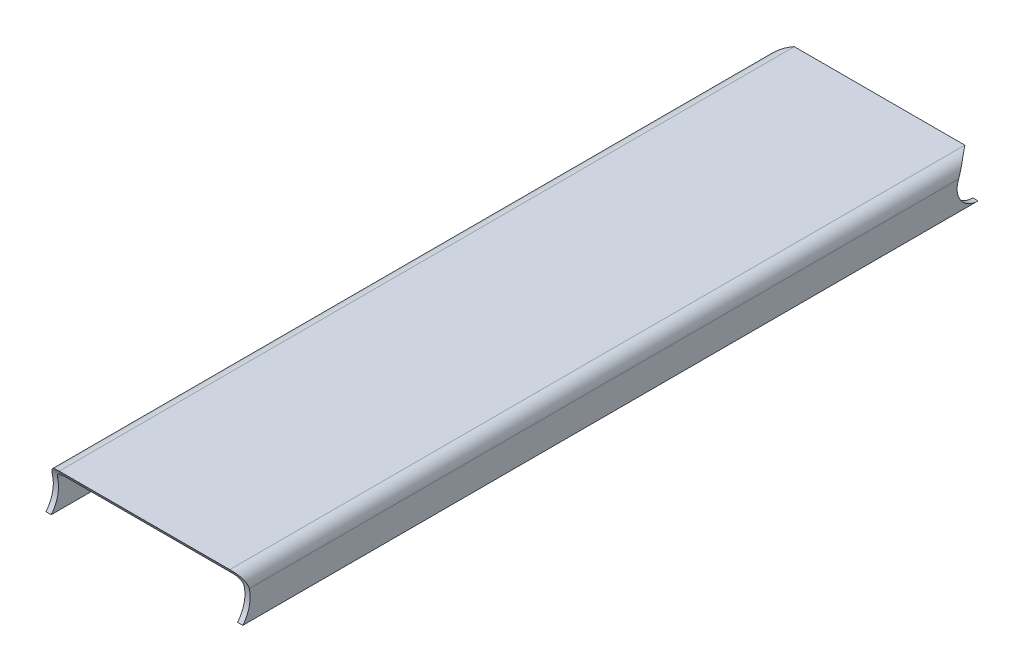
ISO-10303-21;
HEADER;
FILE_DESCRIPTION(('STEP AP214'),'2;1');
FILE_NAME('part.step','',(''),(''),'','','');
FILE_SCHEMA(('AUTOMOTIVE_DESIGN { 1 0 10303 214 1 1 1 1 }'));
ENDSEC;
DATA;
#1=APPLICATION_CONTEXT('core data for automotive mechanical design processes');
#2=APPLICATION_PROTOCOL_DEFINITION('international standard','automotive_design',2000,#1);
#3=PRODUCT_CONTEXT('',#1,'mechanical');
#4=PRODUCT('Part','Part','',(#3));
#5=PRODUCT_RELATED_PRODUCT_CATEGORY('part','',(#4));
#6=PRODUCT_DEFINITION_FORMATION('','',#4);
#7=PRODUCT_DEFINITION_CONTEXT('part definition',#1,'design');
#8=PRODUCT_DEFINITION('design','',#6,#7);
#9=PRODUCT_DEFINITION_SHAPE('','',#8);
#10=(LENGTH_UNIT() NAMED_UNIT(*) SI_UNIT(.MILLI.,.METRE.));
#11=(NAMED_UNIT(*) PLANE_ANGLE_UNIT() SI_UNIT($,.RADIAN.));
#12=(NAMED_UNIT(*) SI_UNIT($,.STERADIAN.) SOLID_ANGLE_UNIT());
#13=UNCERTAINTY_MEASURE_WITH_UNIT(LENGTH_MEASURE(1.E-05),#10,'distance_accuracy_value','');
#14=(GEOMETRIC_REPRESENTATION_CONTEXT(3) GLOBAL_UNCERTAINTY_ASSIGNED_CONTEXT((#13)) GLOBAL_UNIT_ASSIGNED_CONTEXT((#10,
#11,#12)) REPRESENTATION_CONTEXT('',''));
#15=CARTESIAN_POINT('',(0.,0.,0.));
#16=DIRECTION('',(0.,0.,1.));
#17=DIRECTION('',(1.,0.,0.));
#18=AXIS2_PLACEMENT_3D('',#15,#16,#17);
#19=CARTESIAN_POINT('',(0.,205.95,0.));
#20=DIRECTION('',(0.,-1.,0.));
#21=DIRECTION('',(0.,0.,-1.));
#22=AXIS2_PLACEMENT_3D('',#19,#20,#21);
#23=PLANE('',#22);
#24=DIRECTION('',(0.,0.,-1.));
#25=VECTOR('',#24,1.);
#26=CARTESIAN_POINT('',(-45.529019681865,205.95,-290.));
#27=LINE('',#26,#25);
#28=CARTESIAN_POINT('',(-45.529019681865,205.95,-11.2199598930941));
#29=VERTEX_POINT('',#28);
#30=CARTESIAN_POINT('',(-45.529019681865,205.95,-284.727429469414));
#31=VERTEX_POINT('',#30);
#32=EDGE_CURVE('E172',#29,#31,#27,.T.);
#33=ORIENTED_EDGE('',*,*,#32,.F.);
#34=DIRECTION('',(-1.,0.,0.));
#35=VECTOR('',#34,1.);
#36=CARTESIAN_POINT('',(170.,205.95,-11.2199598930941));
#37=LINE('',#36,#35);
#38=CARTESIAN_POINT('',(-110.529019681865,205.95,-11.2199598930941));
#39=VERTEX_POINT('',#38);
#40=EDGE_CURVE('E148',#29,#39,#37,.T.);
#41=ORIENTED_EDGE('',*,*,#40,.T.);
#42=DIRECTION('',(0.,0.,1.));
#43=VECTOR('',#42,1.);
#44=CARTESIAN_POINT('',(-110.529019681865,205.95,-9.90391336807483));
#45=LINE('',#44,#43);
#46=CARTESIAN_POINT('',(-110.529019681865,205.95,-284.727429469414));
#47=VERTEX_POINT('',#46);
#48=EDGE_CURVE('E278',#47,#39,#45,.T.);
#49=ORIENTED_EDGE('',*,*,#48,.F.);
#50=DIRECTION('',(1.,0.,0.));
#51=VECTOR('',#50,1.);
#52=CARTESIAN_POINT('',(-170.,205.95,-284.727429469414));
#53=LINE('',#52,#51);
#54=EDGE_CURVE('E188',#47,#31,#53,.T.);
#55=ORIENTED_EDGE('',*,*,#54,.T.);
#56=EDGE_LOOP('',(#33,#41,#49,#55));
#57=FACE_BOUND('',#56,.T.);
#58=ADVANCED_FACE('F77',(#57),#23,.T.);
#59=CARTESIAN_POINT('',(-45.529019681865,202.95,-9.90391336807489));
#60=DIRECTION('',(0.,0.,1.));
#61=DIRECTION('',(1.,0.,0.));
#62=AXIS2_PLACEMENT_3D('',#59,#60,#61);
#63=CYLINDRICAL_SURFACE('',#62,5.);
#64=DIRECTION('',(0.,0.,-1.));
#65=VECTOR('',#64,1.);
#66=CARTESIAN_POINT('',(-45.529019681865,207.95,-290.));
#67=LINE('',#66,#65);
#68=CARTESIAN_POINT('',(-45.529019681865,207.95,-9.90391336807463));
#69=VERTEX_POINT('',#68);
#70=CARTESIAN_POINT('',(-45.529019681865,207.95,-290.));
#71=VERTEX_POINT('',#70);
#72=EDGE_CURVE('E199',#69,#71,#67,.T.);
#73=ORIENTED_EDGE('',*,*,#72,.F.);
#74=CARTESIAN_POINT('',(-45.529019681865,207.95,-9.90391336807484));
#75=CARTESIAN_POINT('',(-45.406029606907,207.950028263612,-9.90387003739503));
#76=CARTESIAN_POINT('',(-45.283067196336,207.945463134045,-9.90755479631774));
#77=CARTESIAN_POINT('',(-45.038333556143,207.927368144166,-9.92205001642596));
#78=CARTESIAN_POINT('',(-44.9165613594909,207.913846305578,-9.93285410142215));
#79=CARTESIAN_POINT('',(-44.6760920044716,207.878203256688,-9.9611442695003));
#80=CARTESIAN_POINT('',(-44.5573779843092,207.856152138718,-9.97857586925518));
#81=CARTESIAN_POINT('',(-44.3228685379817,207.803828309326,-10.0195493534041));
#82=CARTESIAN_POINT('',(-44.2070736278657,207.773554155196,-10.0430923099859));
#83=CARTESIAN_POINT('',(-43.8659539278287,207.671263765976,-10.1217149752835));
#84=CARTESIAN_POINT('',(-43.6458631228655,207.587621648726,-10.1849191863722));
#85=CARTESIAN_POINT('',(-43.2234939339058,207.392848682418,-10.327162824902));
#86=CARTESIAN_POINT('',(-43.0212544181685,207.281659764191,-10.4062356358823));
#87=CARTESIAN_POINT('',(-42.6145450001111,207.020721613183,-10.5842903675734));
#88=CARTESIAN_POINT('',(-42.4125376145767,206.867995568645,-10.6845177380025));
#89=CARTESIAN_POINT('',(-42.0352981795909,206.535684114599,-10.8909630428112));
#90=CARTESIAN_POINT('',(-41.8600817506678,206.356083155436,-10.9971844229771));
#91=CARTESIAN_POINT('',(-41.6042300096735,206.051275828594,-11.1664196358224));
#92=CARTESIAN_POINT('',(-41.5141837617727,205.933794372096,-11.229370295272));
#93=CARTESIAN_POINT('',(-41.3446600516661,205.69099316407,-11.3543476175291));
#94=CARTESIAN_POINT('',(-41.2651796354233,205.565675617855,-11.4163745342755));
#95=CARTESIAN_POINT('',(-41.1173749970728,205.30785076524,-11.5385034659709));
#96=CARTESIAN_POINT('',(-41.0490442832171,205.175347702813,-11.5986065845169));
#97=CARTESIAN_POINT('',(-40.9241312627906,204.903796877641,-11.7159992356617));
#98=CARTESIAN_POINT('',(-40.8675430407298,204.764752453743,-11.7732901737865));
#99=CARTESIAN_POINT('',(-40.7705292940144,204.491487818732,-11.8800847743001));
#100=CARTESIAN_POINT('',(-40.7292102995672,204.357687032058,-11.9298502651749));
#101=CARTESIAN_POINT('',(-40.6577195670634,204.085861885648,-12.0256602007596));
#102=CARTESIAN_POINT('',(-40.6275455160423,203.947838408714,-12.071705416005));
#103=CARTESIAN_POINT('',(-40.578775760473,203.667868703096,-12.1596999317561));
#104=CARTESIAN_POINT('',(-40.5602247440612,203.525909499091,-12.2016329069738));
#105=CARTESIAN_POINT('',(-40.5353335012985,203.239521061336,-12.2807883295957));
#106=CARTESIAN_POINT('',(-40.529002162767,203.095090106762,-12.3180073299831));
#107=CARTESIAN_POINT('',(-40.529019681865,202.95,-12.3526312987521));
#108=B_SPLINE_CURVE_WITH_KNOTS('',3,(#74,#75,#76,#77,#78,#79,#80,#81,#82,#83,#84,#85,#86,#87,
#88,#89,#90,#91,#92,#93,#94,#95,#96,#97,#98,#99,#100,#101,#102,#103,#104,#105,#106,#107),
.UNSPECIFIED.,.F.,.F.,(4,2,2,2,2,2,2,2,2,2,2,2,2,2,2,2,4),(0.,0.368785478718362,
0.737241115002246,1.10273105365868,1.46828515793402,2.19628036676051,2.9258234591652,
3.73999202725768,4.55463350274145,5.03671738434816,5.51866619829262,6.0003333956542,
6.48175735231109,6.92710108438181,7.37235234009174,7.81930515468036,8.26658293209325),.UNSPECIFIED.);
#109=CARTESIAN_POINT('',(-40.529019681865,202.95,-12.3526312987521));
#110=VERTEX_POINT('',#109);
#111=EDGE_CURVE('E96',#69,#110,#108,.T.);
#112=ORIENTED_EDGE('',*,*,#111,.T.);
#113=DIRECTION('',(0.,0.,1.));
#114=VECTOR('',#113,1.);
#115=CARTESIAN_POINT('',(-40.529019681865,202.95,-290.));
#116=LINE('',#115,#114);
#117=CARTESIAN_POINT('',(-40.529019681865,202.95,-282.617588469883));
#118=VERTEX_POINT('',#117);
#119=EDGE_CURVE('E181',#110,#118,#116,.F.);
#120=ORIENTED_EDGE('',*,*,#119,.T.);
#121=CARTESIAN_POINT('',(-40.529019681865,202.95,-282.617588469883));
#122=CARTESIAN_POINT('',(-40.5290006438511,203.094931821978,-282.675463827754));
#123=CARTESIAN_POINT('',(-40.5353185446872,203.238045744755,-282.73763778325));
#124=CARTESIAN_POINT('',(-40.5595467178436,203.519370186592,-282.869748468944));
#125=CARTESIAN_POINT('',(-40.5774385287805,203.657588145444,-282.939672689866));
#126=CARTESIAN_POINT('',(-40.6235047457603,203.926946853483,-283.085892428578));
#127=CARTESIAN_POINT('',(-40.6515729342616,204.058145199173,-283.162116069589));
#128=CARTESIAN_POINT('',(-40.7169519379051,204.314365453193,-283.320818221456));
#129=CARTESIAN_POINT('',(-40.754267337661,204.439384260822,-283.403299820787));
#130=CARTESIAN_POINT('',(-40.8473199770246,204.712771750927,-283.594801203025));
#131=CARTESIAN_POINT('',(-40.9053308329194,204.859299114923,-283.705350645005));
#132=CARTESIAN_POINT('',(-41.0322221157953,205.141521236854,-283.933678830624));
#133=CARTESIAN_POINT('',(-41.1011040687234,205.277214469999,-284.051458587743));
#134=CARTESIAN_POINT('',(-41.3222111949956,205.668999382745,-284.415009892091));
#135=CARTESIAN_POINT('',(-41.4884924222867,205.908675042715,-284.670193528565));
#136=CARTESIAN_POINT('',(-41.792830758326,206.278610664027,-285.117526100105));
#137=CARTESIAN_POINT('',(-41.9241844559385,206.42002452699,-285.305360025082));
#138=CARTESIAN_POINT('',(-42.1970863137683,206.682838893356,-285.687699864838));
#139=CARTESIAN_POINT('',(-42.3386383834921,206.804231662465,-285.882208323148));
#140=CARTESIAN_POINT('',(-42.6297228499866,207.027717675519,-286.276415677275));
#141=CARTESIAN_POINT('',(-42.7792603017452,207.129798504181,-286.476117818822));
#142=CARTESIAN_POINT('',(-43.0844293214526,207.315301306491,-286.879403912582));
#143=CARTESIAN_POINT('',(-43.2400601794145,207.398725446408,-287.08298741114));
#144=CARTESIAN_POINT('',(-43.5680398380916,207.553246308351,-287.508795038494));
#145=CARTESIAN_POINT('',(-43.7407573471275,207.622913805874,-287.731254770753));
#146=CARTESIAN_POINT('',(-44.0899628153071,207.741990355377,-288.178547174042));
#147=CARTESIAN_POINT('',(-44.2664515149026,207.79139538976,-288.40338030661));
#148=CARTESIAN_POINT('',(-44.7988538490088,207.909716146546,-289.07928503644));
#149=CARTESIAN_POINT('',(-45.1586961007198,207.94919199385,-289.533039615997));
#150=CARTESIAN_POINT('',(-45.5216326749521,207.949995903375,-289.990685336482));
#151=CARTESIAN_POINT('',(-45.5253262132618,207.949999995808,-289.995342711109));
#152=CARTESIAN_POINT('',(-45.529019681865,207.95,-290.));
#153=B_SPLINE_CURVE_WITH_KNOTS('',3,(#121,#122,#123,#124,#125,#126,#127,#128,#129,#130,#131,
#132,#133,#134,#135,#136,#137,#138,#139,#140,#141,#142,#143,#144,#145,#146,#147,#148,#149,#150,
#151,#152),.UNSPECIFIED.,.F.,.F.,(4,2,2,2,2,2,2,2,2,2,2,2,2,2,2,4),(0.,0.467846636004104,
0.934948850335887,1.39730971646662,1.85990027365544,2.43652711880958,3.01323497565311,
4.17090510043605,4.97797349507664,5.78535293954343,6.59324968228011,7.40105256962869,
8.27058662243376,9.14029300126098,10.8747034749208,10.8925360336479),.UNSPECIFIED.);
#154=EDGE_CURVE('E176',#118,#71,#153,.T.);
#155=ORIENTED_EDGE('',*,*,#154,.T.);
#156=EDGE_LOOP('',(#73,#112,#120,#155));
#157=FACE_BOUND('',#156,.T.);
#158=ADVANCED_FACE('F201',(#157),#63,.T.);
#159=CARTESIAN_POINT('',(-45.529019681865,202.95,-9.90391336807489));
#160=DIRECTION('',(0.,0.,1.));
#161=DIRECTION('',(1.,0.,0.));
#162=AXIS2_PLACEMENT_3D('',#159,#160,#161);
#163=CYLINDRICAL_SURFACE('',#162,3.);
#164=CARTESIAN_POINT('',(-45.529019681865,205.95,-11.219959893094));
#165=CARTESIAN_POINT('',(-45.4506356470062,205.950013000491,-11.2199463442241));
#166=CARTESIAN_POINT('',(-45.3722607519408,205.946928342112,-11.2215886554539));
#167=CARTESIAN_POINT('',(-45.216154561184,205.934664528441,-11.2280828540966));
#168=CARTESIAN_POINT('',(-45.1384230132917,205.925487888203,-11.2329334169905));
#169=CARTESIAN_POINT('',(-44.9845175626598,205.901196712448,-11.2457127048108));
#170=CARTESIAN_POINT('',(-44.9083381440571,205.886109653241,-11.2536271842443));
#171=CARTESIAN_POINT('',(-44.7577252915211,205.850190803088,-11.2723411993132));
#172=CARTESIAN_POINT('',(-44.6832919709854,205.829358640149,-11.2831409217652));
#173=CARTESIAN_POINT('',(-44.4635505539701,205.758625799063,-11.3194992440876));
#174=CARTESIAN_POINT('',(-44.3214678673102,205.700435128929,-11.3490461391817));
#175=CARTESIAN_POINT('',(-44.0493408390302,205.56415167147,-11.4164778864309));
#176=CARTESIAN_POINT('',(-43.9193091633716,205.486038261062,-11.4543713730075));
#177=CARTESIAN_POINT('',(-43.6661410862669,205.306937007493,-11.5384909215743));
#178=CARTESIAN_POINT('',(-43.5439080462504,205.20484512819,-11.5850840898714));
#179=CARTESIAN_POINT('',(-43.3177561936445,204.98356201734,-11.681981903289));
#180=CARTESIAN_POINT('',(-43.2138456681383,204.86436309244,-11.7322882133072));
#181=CARTESIAN_POINT('',(-43.0170283584053,204.59916121872,-11.838920401999));
#182=CARTESIAN_POINT('',(-42.9261661330417,204.451679881121,-11.8953569065385));
#183=CARTESIAN_POINT('',(-42.7709406586381,204.142833431299,-12.0064074845721));
#184=CARTESIAN_POINT('',(-42.7065636469668,203.981475582629,-12.0610224909864));
#185=CARTESIAN_POINT('',(-42.6146079442577,203.676127920498,-12.1571923278657));
#186=CARTESIAN_POINT('',(-42.582718106619,203.533647176579,-12.1994176989749));
#187=CARTESIAN_POINT('',(-42.5506207173596,203.316739106714,-12.2594820469814));
#188=CARTESIAN_POINT('',(-42.5425443824827,203.2438664437,-12.278967179084));
#189=CARTESIAN_POINT('',(-42.5317426939541,203.097391490401,-12.3167326043005));
#190=CARTESIAN_POINT('',(-42.5290190637343,203.023788972786,-12.3350125075316));
#191=CARTESIAN_POINT('',(-42.529019681865,202.95,-12.3526312987521));
#192=B_SPLINE_CURVE_WITH_KNOTS('',3,(#164,#165,#166,#167,#168,#169,#170,#171,#172,#173,#174,
#175,#176,#177,#178,#179,#180,#181,#182,#183,#184,#185,#186,#187,#188,#189,#190,#191),
.UNSPECIFIED.,.F.,.F.,(4,2,2,2,2,2,2,2,2,2,2,2,2,4),(0.,0.235059057204755,0.470021131362307,
0.703903635780562,0.937801287517447,1.40459341332839,1.87187071554397,2.36762938014599,
2.8636116992856,3.40769637396751,3.95149796527773,4.40584834200497,4.63326071240981,
4.86074629171233),.UNSPECIFIED.);
#193=CARTESIAN_POINT('',(-42.529019681865,202.95,-12.3526312987521));
#194=VERTEX_POINT('',#193);
#195=EDGE_CURVE('E88',#29,#194,#192,.T.);
#196=ORIENTED_EDGE('',*,*,#195,.F.);
#197=ORIENTED_EDGE('',*,*,#32,.T.);
#198=CARTESIAN_POINT('',(-42.529019681865,202.95,-282.617588469883));
#199=CARTESIAN_POINT('',(-42.5290134603031,203.042750246438,-282.654632964444));
#200=CARTESIAN_POINT('',(-42.533319812726,203.134751217166,-282.693440919307));
#201=CARTESIAN_POINT('',(-42.5500993437211,203.316532206351,-282.774149014554));
#202=CARTESIAN_POINT('',(-42.5625650183876,203.406314186896,-282.816046282397));
#203=CARTESIAN_POINT('',(-42.5951033730633,203.582548823896,-282.902294361126));
#204=CARTESIAN_POINT('',(-42.6151274781737,203.669018935774,-282.946627991868));
#205=CARTESIAN_POINT('',(-42.6623359742361,203.838756588373,-283.037548568733));
#206=CARTESIAN_POINT('',(-42.6895220029008,203.922023391599,-283.084136028247));
#207=CARTESIAN_POINT('',(-42.7809505840203,204.165792653405,-283.226236962662));
#208=CARTESIAN_POINT('',(-42.8552157892825,204.321053178597,-283.324479641744));
#209=CARTESIAN_POINT('',(-43.0279899131511,204.61557276573,-283.524599584463));
#210=CARTESIAN_POINT('',(-43.1265722395674,204.754781468228,-283.626487039496));
#211=CARTESIAN_POINT('',(-43.2982764762512,204.958231226931,-283.78492721532));
#212=CARTESIAN_POINT('',(-43.3637745258265,205.028707050804,-283.841888630135));
#213=CARTESIAN_POINT('',(-43.50185442137,205.163576129688,-283.954531421188));
#214=CARTESIAN_POINT('',(-43.5744382761407,205.227967649577,-284.010212428875));
#215=CARTESIAN_POINT('',(-43.726520527849,205.350103073146,-284.119049607511));
#216=CARTESIAN_POINT('',(-43.8060079989829,205.407857156527,-284.172209569344));
#217=CARTESIAN_POINT('',(-43.9719743246873,205.516207515042,-284.274660506102));
#218=CARTESIAN_POINT('',(-44.0584484052637,205.566808613925,-284.323954078318));
#219=CARTESIAN_POINT('',(-44.2589520328909,205.670740995451,-284.427592815793));
#220=CARTESIAN_POINT('',(-44.3747732572038,205.722071690053,-284.480533585947));
#221=CARTESIAN_POINT('',(-44.6161329878593,205.810597445798,-284.573803238378));
#222=CARTESIAN_POINT('',(-44.7416277979811,205.847852047452,-284.614185112253));
#223=CARTESIAN_POINT('',(-44.9236706760396,205.888790214075,-284.659124095971));
#224=CARTESIAN_POINT('',(-44.977036835633,205.899289189972,-284.67073451827));
#225=CARTESIAN_POINT('',(-45.084823084607,205.917435116522,-284.690890292314));
#226=CARTESIAN_POINT('',(-45.1392428836276,205.925082841472,-284.699436476172));
#227=CARTESIAN_POINT('',(-45.2493266708148,205.937451045985,-284.713293343662));
#228=CARTESIAN_POINT('',(-45.3049974395141,205.942144666275,-284.718574332111));
#229=CARTESIAN_POINT('',(-45.4167816244004,205.948425343344,-284.725652609567));
#230=CARTESIAN_POINT('',(-45.4728953843368,205.950009686804,-284.727446855846));
#231=CARTESIAN_POINT('',(-45.529019681865,205.95,-284.727429469414));
#232=B_SPLINE_CURVE_WITH_KNOTS('',3,(#198,#199,#200,#201,#202,#203,#204,#205,#206,#207,#208,
#209,#210,#211,#212,#213,#214,#215,#216,#217,#218,#219,#220,#221,#222,#223,#224,#225,#226,#227,
#228,#229,#230,#231),.UNSPECIFIED.,.F.,.F.,(4,2,2,2,2,2,2,2,2,2,2,2,2,2,2,2,4),(0.,
0.299450771024664,0.598626531573392,0.895911473720486,1.19326445492908,1.78532039232487,
2.37918596611043,2.71427838940667,3.04946608771461,3.38413265454232,3.71857244485809,
4.12914311540971,4.53795713415705,4.70466618792294,4.87132993641891,5.03948792658209,
5.20779259518721),.UNSPECIFIED.);
#233=CARTESIAN_POINT('',(-42.529019681865,202.95,-282.617588469883));
#234=VERTEX_POINT('',#233);
#235=EDGE_CURVE('E170',#234,#31,#232,.T.);
#236=ORIENTED_EDGE('',*,*,#235,.F.);
#237=DIRECTION('',(0.,0.,1.));
#238=VECTOR('',#237,1.);
#239=CARTESIAN_POINT('',(-42.529019681865,202.95,-290.));
#240=LINE('',#239,#238);
#241=EDGE_CURVE('E161',#234,#194,#240,.T.);
#242=ORIENTED_EDGE('',*,*,#241,.T.);
#243=EDGE_LOOP('',(#196,#197,#236,#242));
#244=FACE_BOUND('',#243,.T.);
#245=ADVANCED_FACE('F168',(#244),#163,.F.);
#246=CARTESIAN_POINT('',(-110.529019681865,202.95,-290.));
#247=DIRECTION('',(0.,0.,-1.));
#248=DIRECTION('',(-1.,0.,0.));
#249=AXIS2_PLACEMENT_3D('',#246,#247,#248);
#250=CYLINDRICAL_SURFACE('',#249,5.);
#251=DIRECTION('',(0.,0.,-1.));
#252=VECTOR('',#251,1.);
#253=CARTESIAN_POINT('',(-115.529019681865,202.95,-9.90391336807483));
#254=LINE('',#253,#252);
#255=CARTESIAN_POINT('',(-115.529019681865,202.95,-282.617588469883));
#256=VERTEX_POINT('',#255);
#257=CARTESIAN_POINT('',(-115.529019681865,202.95,-12.3526312987521));
#258=VERTEX_POINT('',#257);
#259=EDGE_CURVE('E171',#256,#258,#254,.F.);
#260=ORIENTED_EDGE('',*,*,#259,.T.);
#261=CARTESIAN_POINT('',(-115.529019681865,202.95,-12.3526312987521));
#262=CARTESIAN_POINT('',(-115.529036106666,203.094900417568,-12.318051787589));
#263=CARTESIAN_POINT('',(-115.522722020664,203.239140620624,-12.2808859558374));
#264=CARTESIAN_POINT('',(-115.497896312987,203.525162766121,-12.2018467334227));
#265=CARTESIAN_POINT('',(-115.479392924842,203.66694630167,-12.159976536249));
#266=CARTESIAN_POINT('',(-115.430773054649,203.94641342431,-12.0721664533798));
#267=CARTESIAN_POINT('',(-115.400715251654,204.084114000858,-12.0262480203315));
#268=CARTESIAN_POINT('',(-115.329523519156,204.35528723491,-11.9307239670452));
#269=CARTESIAN_POINT('',(-115.288387886421,204.488759238734,-11.8811177806593));
#270=CARTESIAN_POINT('',(-115.149399380745,204.881013972012,-11.727919155404));
#271=CARTESIAN_POINT('',(-115.035795514087,205.132578491366,-11.6196458250786));
#272=CARTESIAN_POINT('',(-114.770567548596,205.611679272356,-11.3960211472958));
#273=CARTESIAN_POINT('',(-114.618874331625,205.839170771855,-11.2806572236011));
#274=CARTESIAN_POINT('',(-114.265939428139,206.285150274904,-11.0388695772375));
#275=CARTESIAN_POINT('',(-114.061513762451,206.50108765189,-10.912365334604));
#276=CARTESIAN_POINT('',(-113.614916969679,206.895371224518,-10.6675996696673));
#277=CARTESIAN_POINT('',(-113.37276340911,207.073734824463,-10.5493344480873));
#278=CARTESIAN_POINT('',(-112.904216001487,207.356576483952,-10.3534749249776));
#279=CARTESIAN_POINT('',(-112.683916907852,207.468677700642,-10.2724440839824));
#280=CARTESIAN_POINT('',(-112.339193378316,207.612484419366,-10.1658072904786));
#281=CARTESIAN_POINT('',(-112.222023239548,207.656332649293,-10.1327706830565));
#282=CARTESIAN_POINT('',(-111.983400007933,207.735451941333,-10.0725000928606));
#283=CARTESIAN_POINT('',(-111.861949366528,207.770727824287,-10.0452628497638));
#284=CARTESIAN_POINT('',(-111.641328579945,207.825741255134,-10.0024357465677));
#285=CARTESIAN_POINT('',(-111.54282104759,207.847185813662,-9.98560121014381));
#286=CARTESIAN_POINT('',(-111.344057192081,207.884159382553,-9.95643425112379));
#287=CARTESIAN_POINT('',(-111.243801276931,207.89968975424,-9.94410079249866));
#288=CARTESIAN_POINT('',(-111.04147991063,207.924718425786,-9.92416802865203));
#289=CARTESIAN_POINT('',(-110.939407381945,207.934181646467,-9.91659625938902));
#290=CARTESIAN_POINT('',(-110.73456703953,207.946831531317,-9.90645649403525));
#291=CARTESIAN_POINT('',(-110.631798845893,207.950014431842,-9.90389149839249));
#292=CARTESIAN_POINT('',(-110.529019681865,207.95,-9.90391336807459));
#293=B_SPLINE_CURVE_WITH_KNOTS('',3,(#261,#262,#263,#264,#265,#266,#267,#268,#269,#270,#271,
#272,#273,#274,#275,#276,#277,#278,#279,#280,#281,#282,#283,#284,#285,#286,#287,#288,#289,#290,
#291,#292),.UNSPECIFIED.,.F.,.F.,(4,2,2,2,2,2,2,2,2,2,2,2,2,2,2,4),(0.,0.446687703023592,
0.893073990093349,1.3372226328239,1.78143960310769,2.66689691940017,3.55397277565483,
4.51905023591968,5.48367968123719,6.26069745629915,6.64847782082652,7.03603960154949,
7.34240884517857,7.64870752617358,7.95676156977664,8.26500016670349),.UNSPECIFIED.);
#294=CARTESIAN_POINT('',(-110.529019681865,207.95,-9.90391336807463));
#295=VERTEX_POINT('',#294);
#296=EDGE_CURVE('E175',#258,#295,#293,.T.);
#297=ORIENTED_EDGE('',*,*,#296,.T.);
#298=DIRECTION('',(0.,0.,1.));
#299=VECTOR('',#298,1.);
#300=CARTESIAN_POINT('',(-110.529019681865,207.95,-9.90391336807483));
#301=LINE('',#300,#299);
#302=CARTESIAN_POINT('',(-110.529019681865,207.95,-290.));
#303=VERTEX_POINT('',#302);
#304=EDGE_CURVE('E282',#303,#295,#301,.T.);
#305=ORIENTED_EDGE('',*,*,#304,.F.);
#306=CARTESIAN_POINT('',(-115.529019681865,202.95,-282.617588469883));
#307=CARTESIAN_POINT('',(-115.529038719879,203.094931821979,-282.675463827754));
#308=CARTESIAN_POINT('',(-115.522720819043,203.238045744755,-282.73763778325));
#309=CARTESIAN_POINT('',(-115.498492645886,203.519370186592,-282.869748468944));
#310=CARTESIAN_POINT('',(-115.480600834949,203.657588145445,-282.939672689866));
#311=CARTESIAN_POINT('',(-115.43453461797,203.926946853484,-283.085892428579));
#312=CARTESIAN_POINT('',(-115.406466429468,204.058145199173,-283.16211606959));
#313=CARTESIAN_POINT('',(-115.341087425825,204.314365453193,-283.320818221456));
#314=CARTESIAN_POINT('',(-115.303772026069,204.439384260822,-283.403299820787));
#315=CARTESIAN_POINT('',(-115.210719386705,204.712771750927,-283.594801203025));
#316=CARTESIAN_POINT('',(-115.152708530811,204.859299114923,-283.705350645005));
#317=CARTESIAN_POINT('',(-115.025817247935,205.141521236854,-283.933678830624));
#318=CARTESIAN_POINT('',(-114.956935295007,205.277214469998,-284.051458587742));
#319=CARTESIAN_POINT('',(-114.735828168735,205.668999382745,-284.415009892091));
#320=CARTESIAN_POINT('',(-114.569546941443,205.908675042715,-284.670193528565));
#321=CARTESIAN_POINT('',(-114.265208605404,206.278610664027,-285.117526100106));
#322=CARTESIAN_POINT('',(-114.133854907791,206.42002452699,-285.305360025082));
#323=CARTESIAN_POINT('',(-113.860953049961,206.682838893356,-285.687699864839));
#324=CARTESIAN_POINT('',(-113.719400980237,206.804231662465,-285.882208323149));
#325=CARTESIAN_POINT('',(-113.428316513743,207.02771767552,-286.276415677276));
#326=CARTESIAN_POINT('',(-113.278779061984,207.129798504181,-286.476117818823));
#327=CARTESIAN_POINT('',(-112.973610042277,207.315301306491,-286.879403912583));
#328=CARTESIAN_POINT('',(-112.817979184316,207.398725446408,-287.082987411141));
#329=CARTESIAN_POINT('',(-112.489999525638,207.553246308351,-287.508795038494));
#330=CARTESIAN_POINT('',(-112.317282016599,207.622913805874,-287.73125477075));
#331=CARTESIAN_POINT('',(-111.968076548426,207.741990355377,-288.178547174044));
#332=CARTESIAN_POINT('',(-111.791587848839,207.79139538976,-288.403380306618));
#333=CARTESIAN_POINT('',(-111.259185514698,207.909716146545,-289.079285036421));
#334=CARTESIAN_POINT('',(-110.899343262885,207.949191993849,-289.533039615898));
#335=CARTESIAN_POINT('',(-110.536406688775,207.949995903375,-289.99068533648));
#336=CARTESIAN_POINT('',(-110.532713150467,207.949999995808,-289.995342711108));
#337=CARTESIAN_POINT('',(-110.529019681865,207.95,-290.));
#338=B_SPLINE_CURVE_WITH_KNOTS('',3,(#306,#307,#308,#309,#310,#311,#312,#313,#314,#315,#316,
#317,#318,#319,#320,#321,#322,#323,#324,#325,#326,#327,#328,#329,#330,#331,#332,#333,#334,#335,
#336,#337),.UNSPECIFIED.,.F.,.F.,(4,2,2,2,2,2,2,2,2,2,2,2,2,2,2,4),(0.,0.467846636004528,
0.934948850336767,1.3973097164671,1.85990027365547,2.43652711880925,3.01323497565251,
4.17090510043615,4.97797349507749,5.78535293954474,6.59324968228065,7.40105256962886,
8.27058662243378,9.1402930012604,10.8747034749207,10.8925360336477),.UNSPECIFIED.);
#339=EDGE_CURVE('E266',#303,#256,#338,.F.);
#340=ORIENTED_EDGE('',*,*,#339,.T.);
#341=EDGE_LOOP('',(#260,#297,#305,#340));
#342=FACE_BOUND('',#341,.T.);
#343=ADVANCED_FACE('F79',(#342),#250,.T.);
#344=CARTESIAN_POINT('',(-110.529019681865,202.95,-290.));
#345=DIRECTION('',(0.,0.,-1.));
#346=DIRECTION('',(-1.,0.,0.));
#347=AXIS2_PLACEMENT_3D('',#344,#345,#346);
#348=CYLINDRICAL_SURFACE('',#347,3.);
#349=CARTESIAN_POINT('',(-113.529019681865,202.95,-12.3526312987521));
#350=CARTESIAN_POINT('',(-113.529027342123,203.037805224027,-12.3316715242145));
#351=CARTESIAN_POINT('',(-113.525165173152,203.125367513143,-12.3097614912652));
#352=CARTESIAN_POINT('',(-113.509885255997,203.299359781992,-12.2642670600141));
#353=CARTESIAN_POINT('',(-113.498470170361,203.385790149803,-12.2406832543638));
#354=CARTESIAN_POINT('',(-113.46830225858,203.556742149953,-12.1921071156009));
#355=CARTESIAN_POINT('',(-113.449566016484,203.641267642754,-12.1671180744183));
#356=CARTESIAN_POINT('',(-113.404993723937,203.808039145433,-12.1159589214906));
#357=CARTESIAN_POINT('',(-113.379157140728,203.890284983752,-12.0897887212431));
#358=CARTESIAN_POINT('',(-113.291406022752,204.132657860643,-12.0099929260746));
#359=CARTESIAN_POINT('',(-113.219192816344,204.288739341072,-11.9549904930831));
#360=CARTESIAN_POINT('',(-113.049427302646,204.586130115462,-11.8440996637876));
#361=CARTESIAN_POINT('',(-112.951857519732,204.727429126849,-11.7882106815203));
#362=CARTESIAN_POINT('',(-112.73002160829,204.996199644665,-11.6768924387097));
#363=CARTESIAN_POINT('',(-112.604991544591,205.12307323113,-11.6215370236604));
#364=CARTESIAN_POINT('',(-112.332751021,205.353814692365,-11.5170631814108));
#365=CARTESIAN_POINT('',(-112.185540356529,205.45768235492,-11.4679448117449));
#366=CARTESIAN_POINT('',(-111.953543842938,205.591665070795,-11.4028790525768));
#367=CARTESIAN_POINT('',(-111.875731487337,205.632185200465,-11.382891340191));
#368=CARTESIAN_POINT('',(-111.716295105498,205.706464332043,-11.345835566392));
#369=CARTESIAN_POINT('',(-111.634673137539,205.740226933974,-11.3287659510953));
#370=CARTESIAN_POINT('',(-111.468342839798,205.800523961359,-11.2980117419879));
#371=CARTESIAN_POINT('',(-111.383639854741,205.827070285017,-11.2843215796018));
#372=CARTESIAN_POINT('',(-111.211762191607,205.872629361075,-11.2606784915843));
#373=CARTESIAN_POINT('',(-111.124588867586,205.891646158173,-11.2507235596191));
#374=CARTESIAN_POINT('',(-110.952983255211,205.921100589848,-11.2352501436384));
#375=CARTESIAN_POINT('',(-110.868634891794,205.931923011294,-11.2295329876313));
#376=CARTESIAN_POINT('',(-110.699201816462,205.946379978497,-11.2218793989448));
#377=CARTESIAN_POINT('',(-110.614117523871,205.950018377376,-11.2199409395836));
#378=CARTESIAN_POINT('',(-110.529019681865,205.95,-11.2199598930941));
#379=B_SPLINE_CURVE_WITH_KNOTS('',3,(#349,#350,#351,#352,#353,#354,#355,#356,#357,#358,#359,
#360,#361,#362,#363,#364,#365,#366,#367,#368,#369,#370,#371,#372,#373,#374,#375,#376,#377,#378),
.UNSPECIFIED.,.F.,.F.,(4,2,2,2,2,2,2,2,2,2,2,2,2,2,4),(0.,0.270704637011472,0.541313896249314,
0.811313686090972,1.0813337402977,1.62037556852477,2.15978989143698,2.71671827520223,
3.27365179604715,3.54327623866744,3.8127566562854,4.08179002167513,4.35067867147026,
4.60598696044377,4.86115827858741),.UNSPECIFIED.);
#380=CARTESIAN_POINT('',(-113.529019681865,202.95,-12.3526312987521));
#381=VERTEX_POINT('',#380);
#382=EDGE_CURVE('E153',#381,#39,#379,.T.);
#383=ORIENTED_EDGE('',*,*,#382,.F.);
#384=DIRECTION('',(0.,0.,-1.));
#385=VECTOR('',#384,1.);
#386=CARTESIAN_POINT('',(-113.529019681865,202.95,-9.90391336807483));
#387=LINE('',#386,#385);
#388=CARTESIAN_POINT('',(-113.529019681865,202.95,-282.617588469883));
#389=VERTEX_POINT('',#388);
#390=EDGE_CURVE('E82',#381,#389,#387,.T.);
#391=ORIENTED_EDGE('',*,*,#390,.T.);
#392=CARTESIAN_POINT('',(-110.529019681865,205.95,-284.727429469414));
#393=CARTESIAN_POINT('',(-110.597140457802,205.950020609738,-284.72746640167));
#394=CARTESIAN_POINT('',(-110.665235562657,205.947680673302,-284.724812321507));
#395=CARTESIAN_POINT('',(-110.800623738406,205.938443532757,-284.71440876578));
#396=CARTESIAN_POINT('',(-110.867917867265,205.931553231972,-284.706667008779));
#397=CARTESIAN_POINT('',(-111.000337440056,205.913490971697,-284.686498960835));
#398=CARTESIAN_POINT('',(-111.065479428325,205.90237316235,-284.674131946427));
#399=CARTESIAN_POINT('',(-111.193985441245,205.876111060419,-284.645170068886));
#400=CARTESIAN_POINT('',(-111.257348880745,205.860965459451,-284.628573832009));
#401=CARTESIAN_POINT('',(-111.443450603834,205.810115880063,-284.573441853924));
#402=CARTESIAN_POINT('',(-111.56310167913,205.768869969242,-284.52941334868));
#403=CARTESIAN_POINT('',(-111.792861306751,205.673651808065,-284.430718197303));
#404=CARTESIAN_POINT('',(-111.902931042988,205.619630812501,-284.376010948012));
#405=CARTESIAN_POINT('',(-112.169481184482,205.468604369832,-284.228245617379));
#406=CARTESIAN_POINT('',(-112.319076853646,205.364108216514,-284.130387950153));
#407=CARTESIAN_POINT('',(-112.594474497347,205.13317657527,-283.927375560808));
#408=CARTESIAN_POINT('',(-112.720238796173,205.006706943919,-283.822209637676));
#409=CARTESIAN_POINT('',(-112.949795485968,204.731198316577,-283.608652919868));
#410=CARTESIAN_POINT('',(-113.053054061892,204.581730487727,-283.500241560447));
#411=CARTESIAN_POINT('',(-113.231785026918,204.264549405916,-283.287895105084));
#412=CARTESIAN_POINT('',(-113.307326459699,204.09688285642,-283.183949463805));
#413=CARTESIAN_POINT('',(-113.393321595859,203.845664260121,-283.041477483336));
#414=CARTESIAN_POINT('',(-113.416392332207,203.768332389615,-282.999280801232));
#415=CARTESIAN_POINT('',(-113.456403121028,203.6110633054,-282.916880262408));
#416=CARTESIAN_POINT('',(-113.473344837006,203.531126805058,-282.876675867514));
#417=CARTESIAN_POINT('',(-113.500807586282,203.36867636265,-282.798425657746));
#418=CARTESIAN_POINT('',(-113.511300300855,203.286152701786,-282.760390019503));
#419=CARTESIAN_POINT('',(-113.525411418048,203.119294516295,-282.686938541105));
#420=CARTESIAN_POINT('',(-113.529024268413,203.034958584567,-282.651524839063));
#421=CARTESIAN_POINT('',(-113.529019681865,202.95,-282.617588469883));
#422=B_SPLINE_CURVE_WITH_KNOTS('',3,(#392,#393,#394,#395,#396,#397,#398,#399,#400,#401,#402,
#403,#404,#405,#406,#407,#408,#409,#410,#411,#412,#413,#414,#415,#416,#417,#418,#419,#420,#421),
.UNSPECIFIED.,.F.,.F.,(4,2,2,2,2,2,2,2,2,2,2,2,2,2,4),(0.,0.204229202592925,0.408149280142594,
0.609540834792767,0.810997889403886,1.21118102554575,1.61291648335162,2.23075578019165,
2.84956383374255,3.48175045183801,4.11235142013811,4.38534128849572,4.65825700768949,
4.93236274296535,5.20668959616269),.UNSPECIFIED.);
#423=EDGE_CURVE('E242',#47,#389,#422,.T.);
#424=ORIENTED_EDGE('',*,*,#423,.F.);
#425=ORIENTED_EDGE('',*,*,#48,.T.);
#426=EDGE_LOOP('',(#383,#391,#424,#425));
#427=FACE_BOUND('',#426,.T.);
#428=ADVANCED_FACE('F352',(#427),#348,.F.);
#429=CARTESIAN_POINT('',(0.,207.95,0.));
#430=DIRECTION('',(0.,-1.,0.));
#431=DIRECTION('',(0.,0.,-1.));
#432=AXIS2_PLACEMENT_3D('',#429,#430,#431);
#433=PLANE('',#432);
#434=DIRECTION('',(-1.,0.,0.));
#435=VECTOR('',#434,1.);
#436=CARTESIAN_POINT('',(-110.529019681865,207.95,-290.));
#437=LINE('',#436,#435);
#438=EDGE_CURVE('E289',#71,#303,#437,.T.);
#439=ORIENTED_EDGE('',*,*,#438,.T.);
#440=ORIENTED_EDGE('',*,*,#304,.T.);
#441=DIRECTION('',(1.,0.,0.));
#442=VECTOR('',#441,1.);
#443=CARTESIAN_POINT('',(-45.529019681865,207.95,-9.90391336807483));
#444=LINE('',#443,#442);
#445=EDGE_CURVE('E287',#295,#69,#444,.T.);
#446=ORIENTED_EDGE('',*,*,#445,.T.);
#447=ORIENTED_EDGE('',*,*,#72,.T.);
#448=EDGE_LOOP('',(#439,#440,#446,#447));
#449=FACE_BOUND('',#448,.T.);
#450=ADVANCED_FACE('F210',(#449),#433,.F.);
#451=CARTESIAN_POINT('',(-40.5290196818643,-1.52113962491344E-13,0.));
#452=DIRECTION('',(-1.,0.,0.));
#453=DIRECTION('',(0.,-1.,0.));
#454=AXIS2_PLACEMENT_3D('',#451,#452,#453);
#455=PLANE('',#454);
#456=CARTESIAN_POINT('',(-40.529019681865,200.,-1.17912409029024E-10));
#457=DIRECTION('',(-1.,0.,0.));
#458=DIRECTION('',(0.,-1.,0.));
#459=AXIS2_PLACEMENT_3D('',#456,#457,#458);
#460=CIRCLE('',#459,12.7);
#461=CARTESIAN_POINT('',(-40.529019681865,192.05,-9.90391336807486));
#462=VERTEX_POINT('',#461);
#463=EDGE_CURVE('E13',#462,#110,#460,.F.);
#464=ORIENTED_EDGE('',*,*,#463,.F.);
#465=DIRECTION('',(0.,0.,-1.));
#466=VECTOR('',#465,1.);
#467=CARTESIAN_POINT('',(-40.529019681865,192.05,0.));
#468=LINE('',#467,#466);
#469=CARTESIAN_POINT('',(-40.529019681865,192.05,-290.));
#470=VERTEX_POINT('',#469);
#471=EDGE_CURVE('E165',#462,#470,#468,.T.);
#472=ORIENTED_EDGE('',*,*,#471,.T.);
#473=CARTESIAN_POINT('',(-40.529019681865,200.000000000001,-290.));
#474=DIRECTION('',(-1.,0.,0.));
#475=DIRECTION('',(0.,-1.,0.));
#476=AXIS2_PLACEMENT_3D('',#473,#474,#475);
#477=CIRCLE('',#476,7.95000000000008);
#478=EDGE_CURVE('E299',#118,#470,#477,.F.);
#479=ORIENTED_EDGE('',*,*,#478,.F.);
#480=ORIENTED_EDGE('',*,*,#119,.F.);
#481=EDGE_LOOP('',(#464,#472,#479,#480));
#482=FACE_BOUND('',#481,.T.);
#483=ADVANCED_FACE('F212',(#482),#455,.F.);
#484=CARTESIAN_POINT('',(-42.5290196818643,-1.5909692516903E-13,0.));
#485=DIRECTION('',(-1.,0.,0.));
#486=DIRECTION('',(0.,-1.,0.));
#487=AXIS2_PLACEMENT_3D('',#484,#485,#486);
#488=PLANE('',#487);
#489=DIRECTION('',(0.,0.,1.));
#490=VECTOR('',#489,1.);
#491=CARTESIAN_POINT('',(-42.529019681865,192.05,-290.));
#492=LINE('',#491,#490);
#493=CARTESIAN_POINT('',(-42.529019681865,192.049999999999,-9.90391336807485));
#494=VERTEX_POINT('',#493);
#495=CARTESIAN_POINT('',(-42.529019681865,192.05,-290.));
#496=VERTEX_POINT('',#495);
#497=EDGE_CURVE('E163',#494,#496,#492,.F.);
#498=ORIENTED_EDGE('',*,*,#497,.F.);
#499=CARTESIAN_POINT('',(-42.529019681865,200.,-1.17912545196387E-10));
#500=DIRECTION('',(-1.,0.,0.));
#501=DIRECTION('',(0.,-1.,0.));
#502=AXIS2_PLACEMENT_3D('',#499,#500,#501);
#503=CIRCLE('',#502,12.7);
#504=EDGE_CURVE('E143',#494,#194,#503,.F.);
#505=ORIENTED_EDGE('',*,*,#504,.T.);
#506=ORIENTED_EDGE('',*,*,#241,.F.);
#507=CARTESIAN_POINT('',(-42.529019681865,200.000000000001,-290.));
#508=DIRECTION('',(-1.,0.,0.));
#509=DIRECTION('',(0.,-1.,0.));
#510=AXIS2_PLACEMENT_3D('',#507,#508,#509);
#511=CIRCLE('',#510,7.95000000000008);
#512=EDGE_CURVE('E164',#234,#496,#511,.F.);
#513=ORIENTED_EDGE('',*,*,#512,.T.);
#514=EDGE_LOOP('',(#498,#505,#506,#513));
#515=FACE_BOUND('',#514,.T.);
#516=ADVANCED_FACE('F158',(#515),#488,.T.);
#517=CARTESIAN_POINT('',(-40.529019681865,192.05,-290.));
#518=DIRECTION('',(0.,1.,0.));
#519=DIRECTION('',(-1.,0.,0.));
#520=AXIS2_PLACEMENT_3D('',#517,#518,#519);
#521=PLANE('',#520);
#522=ORIENTED_EDGE('',*,*,#497,.T.);
#523=DIRECTION('',(-1.,0.,0.));
#524=VECTOR('',#523,1.);
#525=CARTESIAN_POINT('',(-40.529019681865,192.05,-290.));
#526=LINE('',#525,#524);
#527=EDGE_CURVE('E243',#470,#496,#526,.T.);
#528=ORIENTED_EDGE('',*,*,#527,.F.);
#529=ORIENTED_EDGE('',*,*,#471,.F.);
#530=DIRECTION('',(-1.,0.,0.));
#531=VECTOR('',#530,1.);
#532=CARTESIAN_POINT('',(-40.529019681865,192.05,-9.90391336807484));
#533=LINE('',#532,#531);
#534=EDGE_CURVE('E294',#462,#494,#533,.T.);
#535=ORIENTED_EDGE('',*,*,#534,.T.);
#536=EDGE_LOOP('',(#522,#528,#529,#535));
#537=FACE_BOUND('',#536,.T.);
#538=ADVANCED_FACE('F323',(#537),#521,.F.);
#539=CARTESIAN_POINT('',(-115.529019681866,3.38040145789344E-13,0.));
#540=DIRECTION('',(1.,0.,0.));
#541=DIRECTION('',(0.,1.,0.));
#542=AXIS2_PLACEMENT_3D('',#539,#540,#541);
#543=PLANE('',#542);
#544=CARTESIAN_POINT('',(-115.529019681865,200.,-1.17917515305121E-10));
#545=DIRECTION('',(1.,0.,0.));
#546=DIRECTION('',(0.,1.,0.));
#547=AXIS2_PLACEMENT_3D('',#544,#545,#546);
#548=CIRCLE('',#547,12.7);
#549=CARTESIAN_POINT('',(-115.529019681865,192.05,-9.90391336807483));
#550=VERTEX_POINT('',#549);
#551=EDGE_CURVE('E127',#258,#550,#548,.F.);
#552=ORIENTED_EDGE('',*,*,#551,.F.);
#553=ORIENTED_EDGE('',*,*,#259,.F.);
#554=CARTESIAN_POINT('',(-115.529019681865,200.000000000001,-290.));
#555=DIRECTION('',(1.,0.,0.));
#556=DIRECTION('',(0.,1.,0.));
#557=AXIS2_PLACEMENT_3D('',#554,#555,#556);
#558=CIRCLE('',#557,7.95000000000008);
#559=CARTESIAN_POINT('',(-115.529019681865,192.05,-290.));
#560=VERTEX_POINT('',#559);
#561=EDGE_CURVE('E337',#560,#256,#558,.F.);
#562=ORIENTED_EDGE('',*,*,#561,.F.);
#563=DIRECTION('',(0.,0.,1.));
#564=VECTOR('',#563,1.);
#565=CARTESIAN_POINT('',(-115.529019681865,192.05,0.));
#566=LINE('',#565,#564);
#567=EDGE_CURVE('E301',#560,#550,#566,.T.);
#568=ORIENTED_EDGE('',*,*,#567,.T.);
#569=EDGE_LOOP('',(#552,#553,#562,#568));
#570=FACE_BOUND('',#569,.T.);
#571=ADVANCED_FACE('F342',(#570),#543,.F.);
#572=CARTESIAN_POINT('',(-113.529019681866,3.31057183111657E-13,0.));
#573=DIRECTION('',(1.,0.,0.));
#574=DIRECTION('',(0.,1.,0.));
#575=AXIS2_PLACEMENT_3D('',#572,#573,#574);
#576=PLANE('',#575);
#577=ORIENTED_EDGE('',*,*,#390,.F.);
#578=CARTESIAN_POINT('',(-113.529019681865,200.,-1.17917379137758E-10));
#579=DIRECTION('',(1.,0.,0.));
#580=DIRECTION('',(0.,1.,0.));
#581=AXIS2_PLACEMENT_3D('',#578,#579,#580);
#582=CIRCLE('',#581,12.7);
#583=CARTESIAN_POINT('',(-113.529019681865,192.049999999999,-9.90391336807461));
#584=VERTEX_POINT('',#583);
#585=EDGE_CURVE('E120',#381,#584,#582,.F.);
#586=ORIENTED_EDGE('',*,*,#585,.T.);
#587=DIRECTION('',(0.,0.,-1.));
#588=VECTOR('',#587,1.);
#589=CARTESIAN_POINT('',(-113.529019681865,192.05,-9.90391336807483));
#590=LINE('',#589,#588);
#591=CARTESIAN_POINT('',(-113.529019681865,192.05,-290.));
#592=VERTEX_POINT('',#591);
#593=EDGE_CURVE('E302',#592,#584,#590,.F.);
#594=ORIENTED_EDGE('',*,*,#593,.F.);
#595=CARTESIAN_POINT('',(-113.529019681865,200.000000000001,-290.));
#596=DIRECTION('',(1.,0.,0.));
#597=DIRECTION('',(0.,1.,0.));
#598=AXIS2_PLACEMENT_3D('',#595,#596,#597);
#599=CIRCLE('',#598,7.95000000000008);
#600=EDGE_CURVE('E306',#592,#389,#599,.F.);
#601=ORIENTED_EDGE('',*,*,#600,.T.);
#602=EDGE_LOOP('',(#577,#586,#594,#601));
#603=FACE_BOUND('',#602,.T.);
#604=ADVANCED_FACE('F345',(#603),#576,.T.);
#605=CARTESIAN_POINT('',(-115.529019681865,192.05,-9.90391336807483));
#606=DIRECTION('',(0.,1.,0.));
#607=DIRECTION('',(-1.,0.,0.));
#608=AXIS2_PLACEMENT_3D('',#605,#606,#607);
#609=PLANE('',#608);
#610=ORIENTED_EDGE('',*,*,#593,.T.);
#611=DIRECTION('',(1.,0.,0.));
#612=VECTOR('',#611,1.);
#613=CARTESIAN_POINT('',(-115.529019681865,192.05,-9.90391336807483));
#614=LINE('',#613,#612);
#615=EDGE_CURVE('E124',#550,#584,#614,.T.);
#616=ORIENTED_EDGE('',*,*,#615,.F.);
#617=ORIENTED_EDGE('',*,*,#567,.F.);
#618=DIRECTION('',(1.,0.,0.));
#619=VECTOR('',#618,1.);
#620=CARTESIAN_POINT('',(-115.529019681865,192.05,-290.));
#621=LINE('',#620,#619);
#622=EDGE_CURVE('E305',#560,#592,#621,.T.);
#623=ORIENTED_EDGE('',*,*,#622,.T.);
#624=EDGE_LOOP('',(#610,#616,#617,#623));
#625=FACE_BOUND('',#624,.T.);
#626=ADVANCED_FACE('F250',(#625),#609,.F.);
#627=CARTESIAN_POINT('',(-170.,200.000000000001,-290.));
#628=DIRECTION('',(1.,0.,0.));
#629=DIRECTION('',(0.,0.,-1.));
#630=AXIS2_PLACEMENT_3D('',#627,#628,#629);
#631=CYLINDRICAL_SURFACE('',#630,7.95000000000008);
#632=ORIENTED_EDGE('',*,*,#478,.T.);
#633=ORIENTED_EDGE('',*,*,#527,.T.);
#634=ORIENTED_EDGE('',*,*,#512,.F.);
#635=ORIENTED_EDGE('',*,*,#235,.T.);
#636=ORIENTED_EDGE('',*,*,#54,.F.);
#637=ORIENTED_EDGE('',*,*,#423,.T.);
#638=ORIENTED_EDGE('',*,*,#600,.F.);
#639=ORIENTED_EDGE('',*,*,#622,.F.);
#640=ORIENTED_EDGE('',*,*,#561,.T.);
#641=ORIENTED_EDGE('',*,*,#339,.F.);
#642=ORIENTED_EDGE('',*,*,#438,.F.);
#643=ORIENTED_EDGE('',*,*,#154,.F.);
#644=EDGE_LOOP('',(#632,#633,#634,#635,#636,#637,#638,#639,#640,#641,#642,#643));
#645=FACE_BOUND('',#644,.T.);
#646=ADVANCED_FACE('F209',(#645),#631,.F.);
#647=CARTESIAN_POINT('',(170.,200.,-1.17898075438347E-10));
#648=DIRECTION('',(-1.,0.,0.));
#649=DIRECTION('',(0.,0.,1.));
#650=AXIS2_PLACEMENT_3D('',#647,#648,#649);
#651=CYLINDRICAL_SURFACE('',#650,12.7);
#652=ORIENTED_EDGE('',*,*,#445,.F.);
#653=ORIENTED_EDGE('',*,*,#296,.F.);
#654=ORIENTED_EDGE('',*,*,#551,.T.);
#655=ORIENTED_EDGE('',*,*,#615,.T.);
#656=ORIENTED_EDGE('',*,*,#585,.F.);
#657=ORIENTED_EDGE('',*,*,#382,.T.);
#658=ORIENTED_EDGE('',*,*,#40,.F.);
#659=ORIENTED_EDGE('',*,*,#195,.T.);
#660=ORIENTED_EDGE('',*,*,#504,.F.);
#661=ORIENTED_EDGE('',*,*,#534,.F.);
#662=ORIENTED_EDGE('',*,*,#463,.T.);
#663=ORIENTED_EDGE('',*,*,#111,.F.);
#664=EDGE_LOOP('',(#652,#653,#654,#655,#656,#657,#658,#659,#660,#661,#662,#663));
#665=FACE_BOUND('',#664,.T.);
#666=ADVANCED_FACE('F146',(#665),#651,.F.);
#667=CLOSED_SHELL('',(#58,#158,#245,#343,#428,#450,#483,#516,#538,#571,#604,#626,#646,#666));
#668=MANIFOLD_SOLID_BREP('B2',#667);
#669=ADVANCED_BREP_SHAPE_REPRESENTATION('',(#18,#668),#14);
#670=SHAPE_DEFINITION_REPRESENTATION(#9,#669);
ENDSEC;
END-ISO-10303-21;
